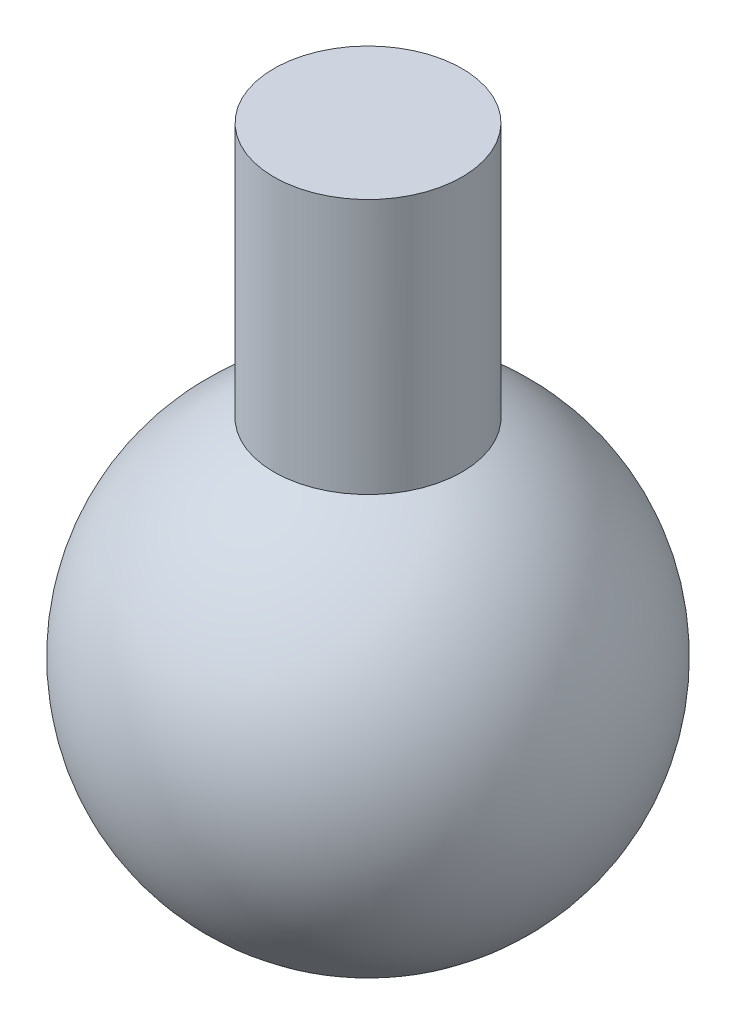
ISO-10303-21;
HEADER;
FILE_DESCRIPTION(('STEP AP214'),'2;1');
FILE_NAME('part.step','',(''),(''),'','','');
FILE_SCHEMA(('AUTOMOTIVE_DESIGN { 1 0 10303 214 1 1 1 1 }'));
ENDSEC;
DATA;
#1=APPLICATION_CONTEXT('core data for automotive mechanical design processes');
#2=APPLICATION_PROTOCOL_DEFINITION('international standard','automotive_design',2000,#1);
#3=PRODUCT_CONTEXT('',#1,'mechanical');
#4=PRODUCT('Part','Part','',(#3));
#5=PRODUCT_RELATED_PRODUCT_CATEGORY('part','',(#4));
#6=PRODUCT_DEFINITION_FORMATION('','',#4);
#7=PRODUCT_DEFINITION_CONTEXT('part definition',#1,'design');
#8=PRODUCT_DEFINITION('design','',#6,#7);
#9=PRODUCT_DEFINITION_SHAPE('','',#8);
#10=(LENGTH_UNIT() NAMED_UNIT(*) SI_UNIT(.MILLI.,.METRE.));
#11=(NAMED_UNIT(*) PLANE_ANGLE_UNIT() SI_UNIT($,.RADIAN.));
#12=(NAMED_UNIT(*) SI_UNIT($,.STERADIAN.) SOLID_ANGLE_UNIT());
#13=UNCERTAINTY_MEASURE_WITH_UNIT(LENGTH_MEASURE(1.E-05),#10,'distance_accuracy_value','');
#14=(GEOMETRIC_REPRESENTATION_CONTEXT(3) GLOBAL_UNCERTAINTY_ASSIGNED_CONTEXT((#13)) GLOBAL_UNIT_ASSIGNED_CONTEXT((#10,
#11,#12)) REPRESENTATION_CONTEXT('',''));
#15=CARTESIAN_POINT('',(0.,0.,0.));
#16=DIRECTION('',(0.,0.,1.));
#17=DIRECTION('',(1.,0.,0.));
#18=AXIS2_PLACEMENT_3D('',#15,#16,#17);
#19=CARTESIAN_POINT('',(0.,0.,0.));
#20=DIRECTION('',(0.,0.,1.));
#21=DIRECTION('',(-1.,0.,0.));
#22=AXIS2_PLACEMENT_3D('',#19,#20,#21);
#23=SPHERICAL_SURFACE('',#22,29.);
#24=CARTESIAN_POINT('',(0.,0.,0.));
#25=DIRECTION('',(0.,-1.,0.));
#26=DIRECTION('',(0.,0.,-1.));
#27=AXIS2_PLACEMENT_3D('',#24,#25,#26);
#28=SPHERICAL_SURFACE('',#27,29.);
#29=CARTESIAN_POINT('',(0.,26.4007575648882,0.));
#30=DIRECTION('',(0.,-1.,0.));
#31=DIRECTION('',(0.,0.,-1.));
#32=AXIS2_PLACEMENT_3D('',#29,#30,#31);
#33=CIRCLE('',#32,12.);
#34=CARTESIAN_POINT('',(0.,26.4007575648882,-12.));
#35=VERTEX_POINT('',#34);
#36=EDGE_CURVE('E10',#35,#35,#33,.F.);
#37=ORIENTED_EDGE('',*,*,#36,.F.);
#38=EDGE_LOOP('',(#37));
#39=FACE_BOUND('',#38,.T.);
#40=ADVANCED_FACE('F37',(#39),#28,.T.);
#41=CARTESIAN_POINT('',(0.,23.,0.));
#42=DIRECTION('',(0.,1.,0.));
#43=DIRECTION('',(0.,0.,1.));
#44=AXIS2_PLACEMENT_3D('',#41,#42,#43);
#45=CYLINDRICAL_SURFACE('',#44,12.);
#46=ORIENTED_EDGE('',*,*,#36,.T.);
#47=EDGE_LOOP('',(#46));
#48=FACE_BOUND('',#47,.T.);
#49=CARTESIAN_POINT('',(0.,59.,0.));
#50=DIRECTION('',(0.,1.,0.));
#51=DIRECTION('',(0.,0.,1.));
#52=AXIS2_PLACEMENT_3D('',#49,#50,#51);
#53=CIRCLE('',#52,12.);
#54=CARTESIAN_POINT('',(0.,59.,12.));
#55=VERTEX_POINT('',#54);
#56=EDGE_CURVE('E44',#55,#55,#53,.T.);
#57=ORIENTED_EDGE('',*,*,#56,.F.);
#58=EDGE_LOOP('',(#57));
#59=FACE_BOUND('',#58,.T.);
#60=ADVANCED_FACE('F53',(#48,#59),#45,.T.);
#61=CARTESIAN_POINT('',(0.,59.,0.));
#62=DIRECTION('',(0.,1.,0.));
#63=DIRECTION('',(0.,0.,1.));
#64=AXIS2_PLACEMENT_3D('',#61,#62,#63);
#65=PLANE('',#64);
#66=ORIENTED_EDGE('',*,*,#56,.T.);
#67=EDGE_LOOP('',(#66));
#68=FACE_BOUND('',#67,.T.);
#69=ADVANCED_FACE('F51',(#68),#65,.T.);
#70=CLOSED_SHELL('',(#40,#60,#69));
#71=MANIFOLD_SOLID_BREP('B2',#70);
#72=ADVANCED_BREP_SHAPE_REPRESENTATION('',(#18,#71),#14);
#73=SHAPE_DEFINITION_REPRESENTATION(#9,#72);
ENDSEC;
END-ISO-10303-21;
